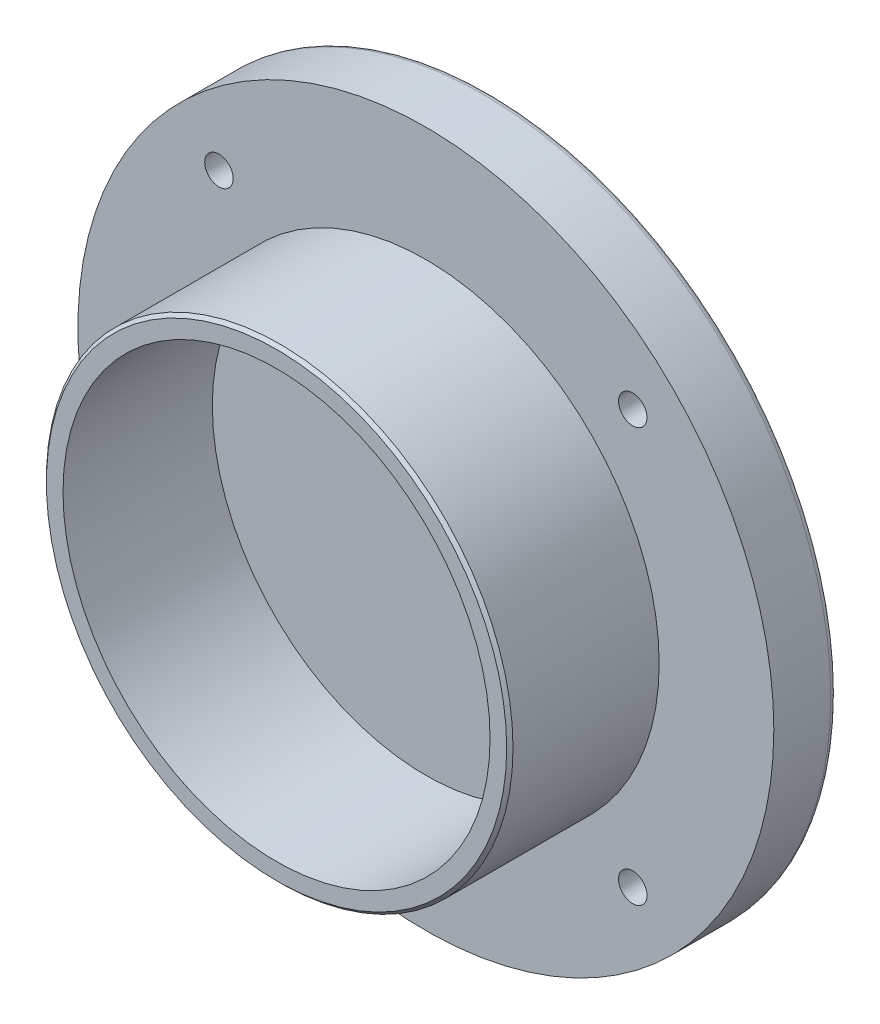
ISO-10303-21;
HEADER;
FILE_DESCRIPTION(('STEP AP214'),'2;1');
FILE_NAME('part.step','',(''),(''),'','','');
FILE_SCHEMA(('AUTOMOTIVE_DESIGN { 1 0 10303 214 1 1 1 1 }'));
ENDSEC;
DATA;
#1=APPLICATION_CONTEXT('core data for automotive mechanical design processes');
#2=APPLICATION_PROTOCOL_DEFINITION('international standard','automotive_design',2000,#1);
#3=PRODUCT_CONTEXT('',#1,'mechanical');
#4=PRODUCT('Part','Part','',(#3));
#5=PRODUCT_RELATED_PRODUCT_CATEGORY('part','',(#4));
#6=PRODUCT_DEFINITION_FORMATION('','',#4);
#7=PRODUCT_DEFINITION_CONTEXT('part definition',#1,'design');
#8=PRODUCT_DEFINITION('design','',#6,#7);
#9=PRODUCT_DEFINITION_SHAPE('','',#8);
#10=(LENGTH_UNIT() NAMED_UNIT(*) SI_UNIT(.MILLI.,.METRE.));
#11=(NAMED_UNIT(*) PLANE_ANGLE_UNIT() SI_UNIT($,.RADIAN.));
#12=(NAMED_UNIT(*) SI_UNIT($,.STERADIAN.) SOLID_ANGLE_UNIT());
#13=UNCERTAINTY_MEASURE_WITH_UNIT(LENGTH_MEASURE(1.E-05),#10,'distance_accuracy_value','');
#14=(GEOMETRIC_REPRESENTATION_CONTEXT(3) GLOBAL_UNCERTAINTY_ASSIGNED_CONTEXT((#13)) GLOBAL_UNIT_ASSIGNED_CONTEXT((#10,
#11,#12)) REPRESENTATION_CONTEXT('',''));
#15=CARTESIAN_POINT('',(0.,0.,0.));
#16=DIRECTION('',(0.,0.,1.));
#17=DIRECTION('',(1.,0.,0.));
#18=AXIS2_PLACEMENT_3D('',#15,#16,#17);
#19=CARTESIAN_POINT('',(0.,0.,47.2));
#20=DIRECTION('',(0.,0.,1.));
#21=DIRECTION('',(1.,0.,0.));
#22=AXIS2_PLACEMENT_3D('',#19,#20,#21);
#23=PLANE('',#22);
#24=CARTESIAN_POINT('',(0.,0.,47.2));
#25=DIRECTION('',(0.,0.,1.));
#26=DIRECTION('',(1.,0.,0.));
#27=AXIS2_PLACEMENT_3D('',#24,#25,#26);
#28=CIRCLE('',#27,72.75);
#29=CARTESIAN_POINT('',(72.75,0.,47.2));
#30=VERTEX_POINT('',#29);
#31=EDGE_CURVE('E46',#30,#30,#28,.T.);
#32=ORIENTED_EDGE('',*,*,#31,.T.);
#33=EDGE_LOOP('',(#32));
#34=FACE_BOUND('',#33,.T.);
#35=CARTESIAN_POINT('',(0.,0.,47.2));
#36=DIRECTION('',(0.,0.,1.));
#37=DIRECTION('',(1.,0.,0.));
#38=AXIS2_PLACEMENT_3D('',#35,#36,#37);
#39=CIRCLE('',#38,67.5);
#40=CARTESIAN_POINT('',(67.5,0.,47.2));
#41=VERTEX_POINT('',#40);
#42=EDGE_CURVE('E54',#41,#41,#39,.T.);
#43=ORIENTED_EDGE('',*,*,#42,.F.);
#44=EDGE_LOOP('',(#43));
#45=FACE_BOUND('',#44,.T.);
#46=ADVANCED_FACE('F39',(#34,#45),#23,.T.);
#47=CARTESIAN_POINT('',(0.,0.,0.));
#48=DIRECTION('',(0.,0.,1.));
#49=DIRECTION('',(1.,0.,0.));
#50=AXIS2_PLACEMENT_3D('',#47,#48,#49);
#51=PLANE('',#50);
#52=CARTESIAN_POINT('',(0.,0.,0.));
#53=DIRECTION('',(0.,0.,1.));
#54=DIRECTION('',(1.,0.,0.));
#55=AXIS2_PLACEMENT_3D('',#52,#53,#54);
#56=CIRCLE('',#55,73.75);
#57=CARTESIAN_POINT('',(73.75,0.,0.));
#58=VERTEX_POINT('',#57);
#59=EDGE_CURVE('E50',#58,#58,#56,.T.);
#60=ORIENTED_EDGE('',*,*,#59,.F.);
#61=EDGE_LOOP('',(#60));
#62=FACE_BOUND('',#61,.T.);
#63=CARTESIAN_POINT('',(0.,0.,0.));
#64=DIRECTION('',(0.,0.,1.));
#65=DIRECTION('',(1.,0.,0.));
#66=AXIS2_PLACEMENT_3D('',#63,#64,#65);
#67=CIRCLE('',#66,67.5);
#68=CARTESIAN_POINT('',(67.5,0.,0.));
#69=VERTEX_POINT('',#68);
#70=EDGE_CURVE('E57',#69,#69,#67,.T.);
#71=ORIENTED_EDGE('',*,*,#70,.T.);
#72=EDGE_LOOP('',(#71));
#73=FACE_BOUND('',#72,.T.);
#74=ADVANCED_FACE('F67',(#62,#73),#51,.F.);
#75=CARTESIAN_POINT('',(0.,0.,47.2));
#76=DIRECTION('',(0.,0.,-1.));
#77=DIRECTION('',(-1.,0.,0.));
#78=AXIS2_PLACEMENT_3D('',#75,#76,#77);
#79=CYLINDRICAL_SURFACE('',#78,73.75);
#80=CARTESIAN_POINT('',(0.,0.,46.2));
#81=DIRECTION('',(0.,0.,1.));
#82=DIRECTION('',(1.,0.,0.));
#83=AXIS2_PLACEMENT_3D('',#80,#81,#82);
#84=CIRCLE('',#83,73.75);
#85=CARTESIAN_POINT('',(73.75,0.,46.2));
#86=VERTEX_POINT('',#85);
#87=EDGE_CURVE('E11',#86,#86,#84,.F.);
#88=ORIENTED_EDGE('',*,*,#87,.T.);
#89=EDGE_LOOP('',(#88));
#90=FACE_BOUND('',#89,.T.);
#91=ORIENTED_EDGE('',*,*,#59,.T.);
#92=EDGE_LOOP('',(#91));
#93=FACE_BOUND('',#92,.T.);
#94=ADVANCED_FACE('F72',(#90,#93),#79,.T.);
#95=CARTESIAN_POINT('',(0.,0.,47.2));
#96=DIRECTION('',(0.,0.,-1.));
#97=DIRECTION('',(-1.,0.,0.));
#98=AXIS2_PLACEMENT_3D('',#95,#96,#97);
#99=CYLINDRICAL_SURFACE('',#98,67.5);
#100=ORIENTED_EDGE('',*,*,#42,.T.);
#101=EDGE_LOOP('',(#100));
#102=FACE_BOUND('',#101,.T.);
#103=ORIENTED_EDGE('',*,*,#70,.F.);
#104=EDGE_LOOP('',(#103));
#105=FACE_BOUND('',#104,.T.);
#106=ADVANCED_FACE('F63',(#102,#105),#99,.F.);
#107=CARTESIAN_POINT('',(0.,0.,47.2));
#108=DIRECTION('',(0.,0.,-1.));
#109=DIRECTION('',(-1.,0.,0.));
#110=AXIS2_PLACEMENT_3D('',#107,#108,#109);
#111=CONICAL_SURFACE('',#110,72.75,0.785398163397448);
#112=ORIENTED_EDGE('',*,*,#87,.F.);
#113=EDGE_LOOP('',(#112));
#114=FACE_BOUND('',#113,.T.);
#115=ORIENTED_EDGE('',*,*,#31,.F.);
#116=EDGE_LOOP('',(#115));
#117=FACE_BOUND('',#116,.T.);
#118=ADVANCED_FACE('F41',(#114,#117),#111,.T.);
#119=CLOSED_SHELL('',(#46,#74,#94,#106,#118));
#120=MANIFOLD_SOLID_BREP('B2',#119);
#121=CARTESIAN_POINT('',(0.,0.,-20.));
#122=DIRECTION('',(0.,0.,1.));
#123=DIRECTION('',(1.,0.,0.));
#124=AXIS2_PLACEMENT_3D('',#121,#122,#123);
#125=CYLINDRICAL_SURFACE('',#124,110.);
#126=CARTESIAN_POINT('',(0.,0.,-18.));
#127=DIRECTION('',(0.,0.,1.));
#128=DIRECTION('',(1.,0.,0.));
#129=AXIS2_PLACEMENT_3D('',#126,#127,#128);
#130=CIRCLE('',#129,110.);
#131=CARTESIAN_POINT('',(110.,0.,-18.));
#132=VERTEX_POINT('',#131);
#133=EDGE_CURVE('E123',#132,#132,#130,.T.);
#134=ORIENTED_EDGE('',*,*,#133,.T.);
#135=EDGE_LOOP('',(#134));
#136=FACE_BOUND('',#135,.T.);
#137=CARTESIAN_POINT('',(0.,0.,0.));
#138=DIRECTION('',(0.,0.,1.));
#139=DIRECTION('',(1.,0.,0.));
#140=AXIS2_PLACEMENT_3D('',#137,#138,#139);
#141=CIRCLE('',#140,110.);
#142=CARTESIAN_POINT('',(110.,0.,0.));
#143=VERTEX_POINT('',#142);
#144=EDGE_CURVE('E127',#143,#143,#141,.T.);
#145=ORIENTED_EDGE('',*,*,#144,.F.);
#146=EDGE_LOOP('',(#145));
#147=FACE_BOUND('',#146,.T.);
#148=ADVANCED_FACE('F116',(#136,#147),#125,.T.);
#149=CARTESIAN_POINT('',(0.,0.,-20.));
#150=DIRECTION('',(0.,0.,1.));
#151=DIRECTION('',(1.,0.,0.));
#152=AXIS2_PLACEMENT_3D('',#149,#150,#151);
#153=PLANE('',#152);
#154=CARTESIAN_POINT('',(0.,0.,-20.));
#155=DIRECTION('',(0.,0.,1.));
#156=DIRECTION('',(1.,0.,0.));
#157=AXIS2_PLACEMENT_3D('',#154,#155,#156);
#158=CIRCLE('',#157,108.);
#159=CARTESIAN_POINT('',(108.,0.,-20.));
#160=VERTEX_POINT('',#159);
#161=EDGE_CURVE('E38',#160,#160,#158,.F.);
#162=ORIENTED_EDGE('',*,*,#161,.T.);
#163=EDGE_LOOP('',(#162));
#164=FACE_BOUND('',#163,.T.);
#165=CARTESIAN_POINT('',(65.4073772597563,-65.407377259755,-20.));
#166=DIRECTION('',(0.,0.,-1.));
#167=DIRECTION('',(-1.,0.,0.));
#168=AXIS2_PLACEMENT_3D('',#165,#166,#167);
#169=CIRCLE('',#168,7.50000000000001);
#170=CARTESIAN_POINT('',(57.9073772597563,-65.407377259755,-20.));
#171=VERTEX_POINT('',#170);
#172=EDGE_CURVE('E178',#171,#171,#169,.T.);
#173=ORIENTED_EDGE('',*,*,#172,.F.);
#174=EDGE_LOOP('',(#173));
#175=FACE_BOUND('',#174,.T.);
#176=CARTESIAN_POINT('',(-65.4073772597556,-65.4073772597556,-20.));
#177=DIRECTION('',(0.,0.,-1.));
#178=DIRECTION('',(-1.,0.,0.));
#179=AXIS2_PLACEMENT_3D('',#176,#177,#178);
#180=CIRCLE('',#179,7.5);
#181=CARTESIAN_POINT('',(-72.9073772597556,-65.4073772597556,-20.));
#182=VERTEX_POINT('',#181);
#183=EDGE_CURVE('E166',#182,#182,#180,.T.);
#184=ORIENTED_EDGE('',*,*,#183,.F.);
#185=EDGE_LOOP('',(#184));
#186=FACE_BOUND('',#185,.T.);
#187=CARTESIAN_POINT('',(-65.4073772597559,65.4073772597554,-20.));
#188=DIRECTION('',(0.,0.,-1.));
#189=DIRECTION('',(-1.,0.,0.));
#190=AXIS2_PLACEMENT_3D('',#187,#188,#189);
#191=CIRCLE('',#190,7.5);
#192=CARTESIAN_POINT('',(-72.9073772597558,65.4073772597554,-20.));
#193=VERTEX_POINT('',#192);
#194=EDGE_CURVE('E154',#193,#193,#191,.T.);
#195=ORIENTED_EDGE('',*,*,#194,.F.);
#196=EDGE_LOOP('',(#195));
#197=FACE_BOUND('',#196,.T.);
#198=CARTESIAN_POINT('',(65.4073772597556,65.4073772597556,-20.));
#199=DIRECTION('',(0.,0.,-1.));
#200=DIRECTION('',(-1.,0.,0.));
#201=AXIS2_PLACEMENT_3D('',#198,#199,#200);
#202=CIRCLE('',#201,7.49999999999999);
#203=CARTESIAN_POINT('',(57.9073772597556,65.4073772597556,-20.));
#204=VERTEX_POINT('',#203);
#205=EDGE_CURVE('E142',#204,#204,#202,.T.);
#206=ORIENTED_EDGE('',*,*,#205,.F.);
#207=EDGE_LOOP('',(#206));
#208=FACE_BOUND('',#207,.T.);
#209=ADVANCED_FACE('F184',(#164,#175,#186,#197,#208),#153,.F.);
#210=CARTESIAN_POINT('',(0.,0.,0.));
#211=DIRECTION('',(0.,0.,1.));
#212=DIRECTION('',(1.,0.,0.));
#213=AXIS2_PLACEMENT_3D('',#210,#211,#212);
#214=PLANE('',#213);
#215=CARTESIAN_POINT('',(65.4073772597563,-65.407377259755,0.));
#216=DIRECTION('',(0.,0.,-1.));
#217=DIRECTION('',(-1.,0.,0.));
#218=AXIS2_PLACEMENT_3D('',#215,#216,#217);
#219=CIRCLE('',#218,4.5);
#220=CARTESIAN_POINT('',(60.9073772597563,-65.407377259755,0.));
#221=VERTEX_POINT('',#220);
#222=EDGE_CURVE('E169',#221,#221,#219,.T.);
#223=ORIENTED_EDGE('',*,*,#222,.T.);
#224=EDGE_LOOP('',(#223));
#225=FACE_BOUND('',#224,.T.);
#226=CARTESIAN_POINT('',(-65.4073772597556,-65.4073772597556,0.));
#227=DIRECTION('',(0.,0.,-1.));
#228=DIRECTION('',(-1.,0.,0.));
#229=AXIS2_PLACEMENT_3D('',#226,#227,#228);
#230=CIRCLE('',#229,4.5);
#231=CARTESIAN_POINT('',(-69.9073772597556,-65.4073772597556,0.));
#232=VERTEX_POINT('',#231);
#233=EDGE_CURVE('E157',#232,#232,#230,.T.);
#234=ORIENTED_EDGE('',*,*,#233,.T.);
#235=EDGE_LOOP('',(#234));
#236=FACE_BOUND('',#235,.T.);
#237=CARTESIAN_POINT('',(-65.4073772597559,65.4073772597554,0.));
#238=DIRECTION('',(0.,0.,-1.));
#239=DIRECTION('',(-1.,0.,0.));
#240=AXIS2_PLACEMENT_3D('',#237,#238,#239);
#241=CIRCLE('',#240,4.5);
#242=CARTESIAN_POINT('',(-69.9073772597559,65.4073772597554,0.));
#243=VERTEX_POINT('',#242);
#244=EDGE_CURVE('E145',#243,#243,#241,.T.);
#245=ORIENTED_EDGE('',*,*,#244,.T.);
#246=EDGE_LOOP('',(#245));
#247=FACE_BOUND('',#246,.T.);
#248=CARTESIAN_POINT('',(65.4073772597556,65.4073772597556,0.));
#249=DIRECTION('',(0.,0.,1.));
#250=DIRECTION('',(1.,0.,0.));
#251=AXIS2_PLACEMENT_3D('',#248,#249,#250);
#252=CIRCLE('',#251,4.49999999999999);
#253=CARTESIAN_POINT('',(69.9073772597556,65.4073772597556,0.));
#254=VERTEX_POINT('',#253);
#255=EDGE_CURVE('E131',#254,#254,#252,.T.);
#256=ORIENTED_EDGE('',*,*,#255,.F.);
#257=EDGE_LOOP('',(#256));
#258=FACE_BOUND('',#257,.T.);
#259=ORIENTED_EDGE('',*,*,#144,.T.);
#260=EDGE_LOOP('',(#259));
#261=FACE_BOUND('',#260,.T.);
#262=ADVANCED_FACE('F187',(#225,#236,#247,#258,#261),#214,.T.);
#263=CARTESIAN_POINT('',(65.4073772597556,65.4073772597556,-20.));
#264=DIRECTION('',(0.,0.,-1.));
#265=DIRECTION('',(-1.,0.,0.));
#266=AXIS2_PLACEMENT_3D('',#263,#264,#265);
#267=CYLINDRICAL_SURFACE('',#266,4.49999999999999);
#268=ORIENTED_EDGE('',*,*,#255,.T.);
#269=EDGE_LOOP('',(#268));
#270=FACE_BOUND('',#269,.T.);
#271=CARTESIAN_POINT('',(65.4073772597556,65.4073772597556,-12.));
#272=DIRECTION('',(0.,0.,-1.));
#273=DIRECTION('',(-1.,0.,0.));
#274=AXIS2_PLACEMENT_3D('',#271,#272,#273);
#275=CIRCLE('',#274,4.5);
#276=CARTESIAN_POINT('',(60.9073772597556,65.4073772597556,-12.));
#277=VERTEX_POINT('',#276);
#278=EDGE_CURVE('E135',#277,#277,#275,.T.);
#279=ORIENTED_EDGE('',*,*,#278,.T.);
#280=EDGE_LOOP('',(#279));
#281=FACE_BOUND('',#280,.T.);
#282=ADVANCED_FACE('F208',(#270,#281),#267,.F.);
#283=CARTESIAN_POINT('',(69.9073772597556,65.4073772597556,-12.));
#284=DIRECTION('',(0.,0.,1.));
#285=DIRECTION('',(1.,0.,0.));
#286=AXIS2_PLACEMENT_3D('',#283,#284,#285);
#287=PLANE('',#286);
#288=ORIENTED_EDGE('',*,*,#278,.F.);
#289=EDGE_LOOP('',(#288));
#290=FACE_BOUND('',#289,.T.);
#291=CARTESIAN_POINT('',(65.4073772597556,65.4073772597556,-12.));
#292=DIRECTION('',(0.,0.,-1.));
#293=DIRECTION('',(-1.,0.,0.));
#294=AXIS2_PLACEMENT_3D('',#291,#292,#293);
#295=CIRCLE('',#294,7.49999999999999);
#296=CARTESIAN_POINT('',(57.9073772597556,65.4073772597556,-12.));
#297=VERTEX_POINT('',#296);
#298=EDGE_CURVE('E139',#297,#297,#295,.T.);
#299=ORIENTED_EDGE('',*,*,#298,.T.);
#300=EDGE_LOOP('',(#299));
#301=FACE_BOUND('',#300,.T.);
#302=ADVANCED_FACE('F198',(#290,#301),#287,.F.);
#303=CARTESIAN_POINT('',(65.4073772597556,65.4073772597556,-20.));
#304=DIRECTION('',(0.,0.,-1.));
#305=DIRECTION('',(-1.,0.,0.));
#306=AXIS2_PLACEMENT_3D('',#303,#304,#305);
#307=CYLINDRICAL_SURFACE('',#306,7.49999999999999);
#308=ORIENTED_EDGE('',*,*,#298,.F.);
#309=EDGE_LOOP('',(#308));
#310=FACE_BOUND('',#309,.T.);
#311=ORIENTED_EDGE('',*,*,#205,.T.);
#312=EDGE_LOOP('',(#311));
#313=FACE_BOUND('',#312,.T.);
#314=ADVANCED_FACE('F195',(#310,#313),#307,.F.);
#315=CARTESIAN_POINT('',(-65.4073772597559,65.4073772597554,-20.));
#316=DIRECTION('',(0.,0.,-1.));
#317=DIRECTION('',(-1.,0.,0.));
#318=AXIS2_PLACEMENT_3D('',#315,#316,#317);
#319=CYLINDRICAL_SURFACE('',#318,4.5);
#320=ORIENTED_EDGE('',*,*,#244,.F.);
#321=EDGE_LOOP('',(#320));
#322=FACE_BOUND('',#321,.T.);
#323=CARTESIAN_POINT('',(-65.4073772597559,65.4073772597554,-12.));
#324=DIRECTION('',(0.,0.,-1.));
#325=DIRECTION('',(-1.,0.,0.));
#326=AXIS2_PLACEMENT_3D('',#323,#324,#325);
#327=CIRCLE('',#326,4.5);
#328=CARTESIAN_POINT('',(-69.9073772597559,65.4073772597554,-12.));
#329=VERTEX_POINT('',#328);
#330=EDGE_CURVE('E148',#329,#329,#327,.T.);
#331=ORIENTED_EDGE('',*,*,#330,.T.);
#332=EDGE_LOOP('',(#331));
#333=FACE_BOUND('',#332,.T.);
#334=ADVANCED_FACE('F197',(#322,#333),#319,.F.);
#335=CARTESIAN_POINT('',(-60.9073772597559,65.4073772597554,-12.));
#336=DIRECTION('',(0.,0.,1.));
#337=DIRECTION('',(1.,0.,0.));
#338=AXIS2_PLACEMENT_3D('',#335,#336,#337);
#339=PLANE('',#338);
#340=ORIENTED_EDGE('',*,*,#330,.F.);
#341=EDGE_LOOP('',(#340));
#342=FACE_BOUND('',#341,.T.);
#343=CARTESIAN_POINT('',(-65.4073772597559,65.4073772597554,-12.));
#344=DIRECTION('',(0.,0.,-1.));
#345=DIRECTION('',(-1.,0.,0.));
#346=AXIS2_PLACEMENT_3D('',#343,#344,#345);
#347=CIRCLE('',#346,7.5);
#348=CARTESIAN_POINT('',(-72.9073772597558,65.4073772597554,-12.));
#349=VERTEX_POINT('',#348);
#350=EDGE_CURVE('E151',#349,#349,#347,.T.);
#351=ORIENTED_EDGE('',*,*,#350,.T.);
#352=EDGE_LOOP('',(#351));
#353=FACE_BOUND('',#352,.T.);
#354=ADVANCED_FACE('F205',(#342,#353),#339,.F.);
#355=CARTESIAN_POINT('',(-65.4073772597559,65.4073772597554,-20.));
#356=DIRECTION('',(0.,0.,-1.));
#357=DIRECTION('',(-1.,0.,0.));
#358=AXIS2_PLACEMENT_3D('',#355,#356,#357);
#359=CYLINDRICAL_SURFACE('',#358,7.5);
#360=ORIENTED_EDGE('',*,*,#350,.F.);
#361=EDGE_LOOP('',(#360));
#362=FACE_BOUND('',#361,.T.);
#363=ORIENTED_EDGE('',*,*,#194,.T.);
#364=EDGE_LOOP('',(#363));
#365=FACE_BOUND('',#364,.T.);
#366=ADVANCED_FACE('F261',(#362,#365),#359,.F.);
#367=CARTESIAN_POINT('',(-65.4073772597556,-65.4073772597556,-20.));
#368=DIRECTION('',(0.,0.,-1.));
#369=DIRECTION('',(-1.,0.,0.));
#370=AXIS2_PLACEMENT_3D('',#367,#368,#369);
#371=CYLINDRICAL_SURFACE('',#370,4.5);
#372=ORIENTED_EDGE('',*,*,#233,.F.);
#373=EDGE_LOOP('',(#372));
#374=FACE_BOUND('',#373,.T.);
#375=CARTESIAN_POINT('',(-65.4073772597556,-65.4073772597556,-12.));
#376=DIRECTION('',(0.,0.,-1.));
#377=DIRECTION('',(-1.,0.,0.));
#378=AXIS2_PLACEMENT_3D('',#375,#376,#377);
#379=CIRCLE('',#378,4.5);
#380=CARTESIAN_POINT('',(-69.9073772597556,-65.4073772597556,-12.));
#381=VERTEX_POINT('',#380);
#382=EDGE_CURVE('E160',#381,#381,#379,.T.);
#383=ORIENTED_EDGE('',*,*,#382,.T.);
#384=EDGE_LOOP('',(#383));
#385=FACE_BOUND('',#384,.T.);
#386=ADVANCED_FACE('F271',(#374,#385),#371,.F.);
#387=CARTESIAN_POINT('',(-60.9073772597556,-65.4073772597556,-12.));
#388=DIRECTION('',(0.,0.,1.));
#389=DIRECTION('',(1.,0.,0.));
#390=AXIS2_PLACEMENT_3D('',#387,#388,#389);
#391=PLANE('',#390);
#392=ORIENTED_EDGE('',*,*,#382,.F.);
#393=EDGE_LOOP('',(#392));
#394=FACE_BOUND('',#393,.T.);
#395=CARTESIAN_POINT('',(-65.4073772597556,-65.4073772597556,-12.));
#396=DIRECTION('',(0.,0.,-1.));
#397=DIRECTION('',(-1.,0.,0.));
#398=AXIS2_PLACEMENT_3D('',#395,#396,#397);
#399=CIRCLE('',#398,7.5);
#400=CARTESIAN_POINT('',(-72.9073772597556,-65.4073772597556,-12.));
#401=VERTEX_POINT('',#400);
#402=EDGE_CURVE('E163',#401,#401,#399,.T.);
#403=ORIENTED_EDGE('',*,*,#402,.T.);
#404=EDGE_LOOP('',(#403));
#405=FACE_BOUND('',#404,.T.);
#406=ADVANCED_FACE('F281',(#394,#405),#391,.F.);
#407=CARTESIAN_POINT('',(-65.4073772597556,-65.4073772597556,-20.));
#408=DIRECTION('',(0.,0.,-1.));
#409=DIRECTION('',(-1.,0.,0.));
#410=AXIS2_PLACEMENT_3D('',#407,#408,#409);
#411=CYLINDRICAL_SURFACE('',#410,7.5);
#412=ORIENTED_EDGE('',*,*,#402,.F.);
#413=EDGE_LOOP('',(#412));
#414=FACE_BOUND('',#413,.T.);
#415=ORIENTED_EDGE('',*,*,#183,.T.);
#416=EDGE_LOOP('',(#415));
#417=FACE_BOUND('',#416,.T.);
#418=ADVANCED_FACE('F291',(#414,#417),#411,.F.);
#419=CARTESIAN_POINT('',(65.4073772597563,-65.407377259755,-20.));
#420=DIRECTION('',(0.,0.,-1.));
#421=DIRECTION('',(-1.,0.,0.));
#422=AXIS2_PLACEMENT_3D('',#419,#420,#421);
#423=CYLINDRICAL_SURFACE('',#422,4.5);
#424=ORIENTED_EDGE('',*,*,#222,.F.);
#425=EDGE_LOOP('',(#424));
#426=FACE_BOUND('',#425,.T.);
#427=CARTESIAN_POINT('',(65.4073772597563,-65.407377259755,-12.));
#428=DIRECTION('',(0.,0.,-1.));
#429=DIRECTION('',(-1.,0.,0.));
#430=AXIS2_PLACEMENT_3D('',#427,#428,#429);
#431=CIRCLE('',#430,4.5);
#432=CARTESIAN_POINT('',(60.9073772597563,-65.407377259755,-12.));
#433=VERTEX_POINT('',#432);
#434=EDGE_CURVE('E172',#433,#433,#431,.T.);
#435=ORIENTED_EDGE('',*,*,#434,.T.);
#436=EDGE_LOOP('',(#435));
#437=FACE_BOUND('',#436,.T.);
#438=ADVANCED_FACE('F301',(#426,#437),#423,.F.);
#439=CARTESIAN_POINT('',(69.9073772597563,-65.407377259755,-12.));
#440=DIRECTION('',(0.,0.,1.));
#441=DIRECTION('',(1.,0.,0.));
#442=AXIS2_PLACEMENT_3D('',#439,#440,#441);
#443=PLANE('',#442);
#444=ORIENTED_EDGE('',*,*,#434,.F.);
#445=EDGE_LOOP('',(#444));
#446=FACE_BOUND('',#445,.T.);
#447=CARTESIAN_POINT('',(65.4073772597563,-65.407377259755,-12.));
#448=DIRECTION('',(0.,0.,-1.));
#449=DIRECTION('',(-1.,0.,0.));
#450=AXIS2_PLACEMENT_3D('',#447,#448,#449);
#451=CIRCLE('',#450,7.49999999999999);
#452=CARTESIAN_POINT('',(57.9073772597563,-65.407377259755,-12.));
#453=VERTEX_POINT('',#452);
#454=EDGE_CURVE('E175',#453,#453,#451,.T.);
#455=ORIENTED_EDGE('',*,*,#454,.T.);
#456=EDGE_LOOP('',(#455));
#457=FACE_BOUND('',#456,.T.);
#458=ADVANCED_FACE('F311',(#446,#457),#443,.F.);
#459=CARTESIAN_POINT('',(65.4073772597563,-65.407377259755,-20.));
#460=DIRECTION('',(0.,0.,-1.));
#461=DIRECTION('',(-1.,0.,0.));
#462=AXIS2_PLACEMENT_3D('',#459,#460,#461);
#463=CYLINDRICAL_SURFACE('',#462,7.5);
#464=ORIENTED_EDGE('',*,*,#454,.F.);
#465=EDGE_LOOP('',(#464));
#466=FACE_BOUND('',#465,.T.);
#467=ORIENTED_EDGE('',*,*,#172,.T.);
#468=EDGE_LOOP('',(#467));
#469=FACE_BOUND('',#468,.T.);
#470=ADVANCED_FACE('F182',(#466,#469),#463,.F.);
#471=CARTESIAN_POINT('',(0.,0.,-18.));
#472=DIRECTION('',(0.,0.,1.));
#473=DIRECTION('',(1.,0.,0.));
#474=AXIS2_PLACEMENT_3D('',#471,#472,#473);
#475=TOROIDAL_SURFACE('',#474,108.,2.);
#476=ORIENTED_EDGE('',*,*,#161,.F.);
#477=EDGE_LOOP('',(#476));
#478=FACE_BOUND('',#477,.T.);
#479=ORIENTED_EDGE('',*,*,#133,.F.);
#480=EDGE_LOOP('',(#479));
#481=FACE_BOUND('',#480,.T.);
#482=ADVANCED_FACE('F118',(#478,#481),#475,.T.);
#483=CLOSED_SHELL('',(#148,#209,#262,#282,#302,#314,#334,#354,#366,#386,#406,#418,#438,#458,
#470,#482));
#484=MANIFOLD_SOLID_BREP('B6',#483);
#485=ADVANCED_BREP_SHAPE_REPRESENTATION('',(#18,#120,#484),#14);
#486=SHAPE_DEFINITION_REPRESENTATION(#9,#485);
ENDSEC;
END-ISO-10303-21;
